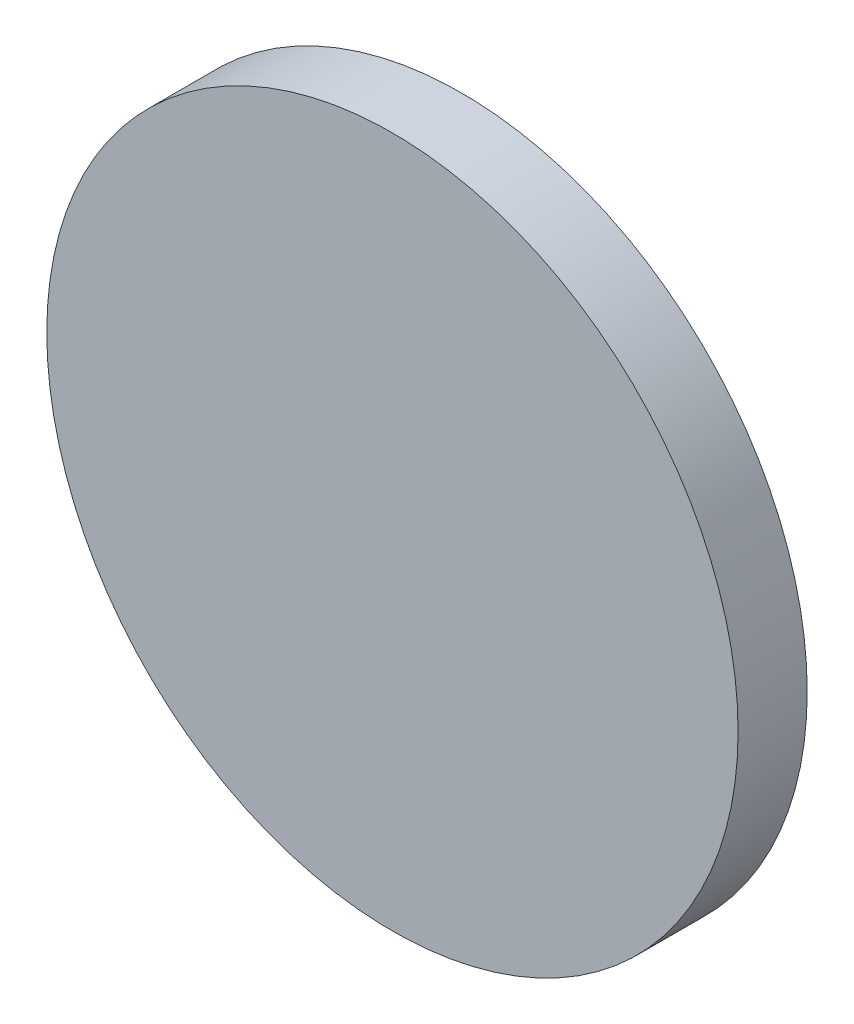
ISO-10303-21;
HEADER;
FILE_DESCRIPTION(('STEP AP214'),'2;1');
FILE_NAME('part.step','',(''),(''),'','','');
FILE_SCHEMA(('AUTOMOTIVE_DESIGN { 1 0 10303 214 1 1 1 1 }'));
ENDSEC;
DATA;
#1=APPLICATION_CONTEXT('core data for automotive mechanical design processes');
#2=APPLICATION_PROTOCOL_DEFINITION('international standard','automotive_design',2000,#1);
#3=PRODUCT_CONTEXT('',#1,'mechanical');
#4=PRODUCT('Part','Part','',(#3));
#5=PRODUCT_RELATED_PRODUCT_CATEGORY('part','',(#4));
#6=PRODUCT_DEFINITION_FORMATION('','',#4);
#7=PRODUCT_DEFINITION_CONTEXT('part definition',#1,'design');
#8=PRODUCT_DEFINITION('design','',#6,#7);
#9=PRODUCT_DEFINITION_SHAPE('','',#8);
#10=(LENGTH_UNIT() NAMED_UNIT(*) SI_UNIT(.MILLI.,.METRE.));
#11=(NAMED_UNIT(*) PLANE_ANGLE_UNIT() SI_UNIT($,.RADIAN.));
#12=(NAMED_UNIT(*) SI_UNIT($,.STERADIAN.) SOLID_ANGLE_UNIT());
#13=UNCERTAINTY_MEASURE_WITH_UNIT(LENGTH_MEASURE(1.E-05),#10,'distance_accuracy_value','');
#14=(GEOMETRIC_REPRESENTATION_CONTEXT(3) GLOBAL_UNCERTAINTY_ASSIGNED_CONTEXT((#13)) GLOBAL_UNIT_ASSIGNED_CONTEXT((#10,
#11,#12)) REPRESENTATION_CONTEXT('',''));
#15=CARTESIAN_POINT('',(0.,0.,0.));
#16=DIRECTION('',(0.,0.,1.));
#17=DIRECTION('',(1.,0.,0.));
#18=AXIS2_PLACEMENT_3D('',#15,#16,#17);
#19=CARTESIAN_POINT('',(0.,0.,5.08));
#20=DIRECTION('',(0.,0.,-1.));
#21=DIRECTION('',(-1.,0.,0.));
#22=AXIS2_PLACEMENT_3D('',#19,#20,#21);
#23=CYLINDRICAL_SURFACE('',#22,25.4);
#24=CARTESIAN_POINT('',(0.,0.,5.08));
#25=DIRECTION('',(0.,0.,1.));
#26=DIRECTION('',(1.,0.,0.));
#27=AXIS2_PLACEMENT_3D('',#24,#25,#26);
#28=CIRCLE('',#27,25.4);
#29=CARTESIAN_POINT('',(25.4,0.,5.08));
#30=VERTEX_POINT('',#29);
#31=EDGE_CURVE('E10',#30,#30,#28,.T.);
#32=ORIENTED_EDGE('',*,*,#31,.F.);
#33=EDGE_LOOP('',(#32));
#34=FACE_BOUND('',#33,.T.);
#35=CARTESIAN_POINT('',(0.,0.,0.));
#36=DIRECTION('',(0.,0.,1.));
#37=DIRECTION('',(1.,0.,0.));
#38=AXIS2_PLACEMENT_3D('',#35,#36,#37);
#39=CIRCLE('',#38,25.4);
#40=CARTESIAN_POINT('',(25.4,0.,0.));
#41=VERTEX_POINT('',#40);
#42=EDGE_CURVE('E34',#41,#41,#39,.T.);
#43=ORIENTED_EDGE('',*,*,#42,.T.);
#44=EDGE_LOOP('',(#43));
#45=FACE_BOUND('',#44,.T.);
#46=ADVANCED_FACE('F31',(#34,#45),#23,.T.);
#47=CARTESIAN_POINT('',(0.,0.,5.08));
#48=DIRECTION('',(0.,0.,1.));
#49=DIRECTION('',(1.,0.,0.));
#50=AXIS2_PLACEMENT_3D('',#47,#48,#49);
#51=PLANE('',#50);
#52=ORIENTED_EDGE('',*,*,#31,.T.);
#53=EDGE_LOOP('',(#52));
#54=FACE_BOUND('',#53,.T.);
#55=ADVANCED_FACE('F46',(#54),#51,.T.);
#56=CARTESIAN_POINT('',(0.,0.,0.));
#57=DIRECTION('',(0.,0.,1.));
#58=DIRECTION('',(1.,0.,0.));
#59=AXIS2_PLACEMENT_3D('',#56,#57,#58);
#60=PLANE('',#59);
#61=ORIENTED_EDGE('',*,*,#42,.F.);
#62=EDGE_LOOP('',(#61));
#63=FACE_BOUND('',#62,.T.);
#64=ADVANCED_FACE('F44',(#63),#60,.F.);
#65=CLOSED_SHELL('',(#46,#55,#64));
#66=MANIFOLD_SOLID_BREP('B2',#65);
#67=ADVANCED_BREP_SHAPE_REPRESENTATION('',(#18,#66),#14);
#68=SHAPE_DEFINITION_REPRESENTATION(#9,#67);
ENDSEC;
END-ISO-10303-21;
